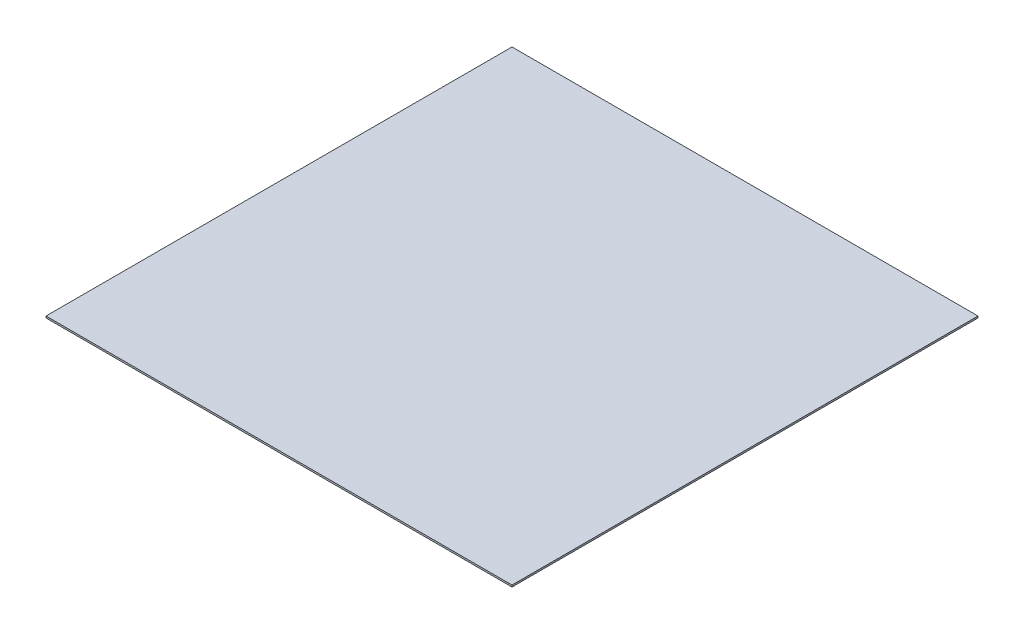
ISO-10303-21;
HEADER;
FILE_DESCRIPTION(('STEP AP214'),'2;1');
FILE_NAME('part.step','',(''),(''),'','','');
FILE_SCHEMA(('AUTOMOTIVE_DESIGN { 1 0 10303 214 1 1 1 1 }'));
ENDSEC;
DATA;
#1=APPLICATION_CONTEXT('core data for automotive mechanical design processes');
#2=APPLICATION_PROTOCOL_DEFINITION('international standard','automotive_design',2000,#1);
#3=PRODUCT_CONTEXT('',#1,'mechanical');
#4=PRODUCT('Part','Part','',(#3));
#5=PRODUCT_RELATED_PRODUCT_CATEGORY('part','',(#4));
#6=PRODUCT_DEFINITION_FORMATION('','',#4);
#7=PRODUCT_DEFINITION_CONTEXT('part definition',#1,'design');
#8=PRODUCT_DEFINITION('design','',#6,#7);
#9=PRODUCT_DEFINITION_SHAPE('','',#8);
#10=(LENGTH_UNIT() NAMED_UNIT(*) SI_UNIT(.MILLI.,.METRE.));
#11=(NAMED_UNIT(*) PLANE_ANGLE_UNIT() SI_UNIT($,.RADIAN.));
#12=(NAMED_UNIT(*) SI_UNIT($,.STERADIAN.) SOLID_ANGLE_UNIT());
#13=UNCERTAINTY_MEASURE_WITH_UNIT(LENGTH_MEASURE(1.E-05),#10,'distance_accuracy_value','');
#14=(GEOMETRIC_REPRESENTATION_CONTEXT(3) GLOBAL_UNCERTAINTY_ASSIGNED_CONTEXT((#13)) GLOBAL_UNIT_ASSIGNED_CONTEXT((#10,
#11,#12)) REPRESENTATION_CONTEXT('',''));
#15=CARTESIAN_POINT('',(0.,0.,0.));
#16=DIRECTION('',(0.,0.,1.));
#17=DIRECTION('',(1.,0.,0.));
#18=AXIS2_PLACEMENT_3D('',#15,#16,#17);
#19=CARTESIAN_POINT('',(400.,3.,400.));
#20=DIRECTION('',(-1.,0.,0.));
#21=DIRECTION('',(0.,0.,1.));
#22=AXIS2_PLACEMENT_3D('',#19,#20,#21);
#23=PLANE('',#22);
#24=DIRECTION('',(0.,0.,-1.));
#25=VECTOR('',#24,1.);
#26=CARTESIAN_POINT('',(400.,0.,400.));
#27=LINE('',#26,#25);
#28=CARTESIAN_POINT('',(400.,0.,400.));
#29=VERTEX_POINT('',#28);
#30=CARTESIAN_POINT('',(400.,0.,-400.));
#31=VERTEX_POINT('',#30);
#32=EDGE_CURVE('E98',#29,#31,#27,.T.);
#33=ORIENTED_EDGE('',*,*,#32,.T.);
#34=DIRECTION('',(0.,-1.,0.));
#35=VECTOR('',#34,1.);
#36=CARTESIAN_POINT('',(400.,3.,-400.));
#37=LINE('',#36,#35);
#38=CARTESIAN_POINT('',(400.,3.,-400.));
#39=VERTEX_POINT('',#38);
#40=EDGE_CURVE('E11',#39,#31,#37,.T.);
#41=ORIENTED_EDGE('',*,*,#40,.F.);
#42=DIRECTION('',(0.,0.,-1.));
#43=VECTOR('',#42,1.);
#44=CARTESIAN_POINT('',(400.,3.,400.));
#45=LINE('',#44,#43);
#46=CARTESIAN_POINT('',(400.,3.,400.));
#47=VERTEX_POINT('',#46);
#48=EDGE_CURVE('E86',#47,#39,#45,.T.);
#49=ORIENTED_EDGE('',*,*,#48,.F.);
#50=DIRECTION('',(0.,-1.,0.));
#51=VECTOR('',#50,1.);
#52=CARTESIAN_POINT('',(400.,3.,400.));
#53=LINE('',#52,#51);
#54=EDGE_CURVE('E94',#47,#29,#53,.T.);
#55=ORIENTED_EDGE('',*,*,#54,.T.);
#56=EDGE_LOOP('',(#33,#41,#49,#55));
#57=FACE_BOUND('',#56,.T.);
#58=ADVANCED_FACE('F35',(#57),#23,.F.);
#59=CARTESIAN_POINT('',(-400.,3.,-400.));
#60=DIRECTION('',(0.,0.,1.));
#61=DIRECTION('',(1.,0.,0.));
#62=AXIS2_PLACEMENT_3D('',#59,#60,#61);
#63=PLANE('',#62);
#64=DIRECTION('',(-1.,0.,0.));
#65=VECTOR('',#64,1.);
#66=CARTESIAN_POINT('',(-400.,0.,-400.));
#67=LINE('',#66,#65);
#68=CARTESIAN_POINT('',(-400.,0.,-400.));
#69=VERTEX_POINT('',#68);
#70=EDGE_CURVE('E90',#31,#69,#67,.T.);
#71=ORIENTED_EDGE('',*,*,#70,.T.);
#72=DIRECTION('',(0.,-1.,0.));
#73=VECTOR('',#72,1.);
#74=CARTESIAN_POINT('',(-400.,3.,-400.));
#75=LINE('',#74,#73);
#76=CARTESIAN_POINT('',(-400.,3.,-400.));
#77=VERTEX_POINT('',#76);
#78=EDGE_CURVE('E43',#77,#69,#75,.T.);
#79=ORIENTED_EDGE('',*,*,#78,.F.);
#80=DIRECTION('',(-1.,0.,0.));
#81=VECTOR('',#80,1.);
#82=CARTESIAN_POINT('',(-400.,3.,-400.));
#83=LINE('',#82,#81);
#84=EDGE_CURVE('E81',#39,#77,#83,.T.);
#85=ORIENTED_EDGE('',*,*,#84,.F.);
#86=ORIENTED_EDGE('',*,*,#40,.T.);
#87=EDGE_LOOP('',(#71,#79,#85,#86));
#88=FACE_BOUND('',#87,.T.);
#89=ADVANCED_FACE('F89',(#88),#63,.F.);
#90=CARTESIAN_POINT('',(-400.,3.,400.));
#91=DIRECTION('',(1.,0.,0.));
#92=DIRECTION('',(0.,0.,-1.));
#93=AXIS2_PLACEMENT_3D('',#90,#91,#92);
#94=PLANE('',#93);
#95=DIRECTION('',(0.,0.,1.));
#96=VECTOR('',#95,1.);
#97=CARTESIAN_POINT('',(-400.,0.,400.));
#98=LINE('',#97,#96);
#99=CARTESIAN_POINT('',(-400.,0.,400.));
#100=VERTEX_POINT('',#99);
#101=EDGE_CURVE('E68',#69,#100,#98,.T.);
#102=ORIENTED_EDGE('',*,*,#101,.T.);
#103=DIRECTION('',(0.,-1.,0.));
#104=VECTOR('',#103,1.);
#105=CARTESIAN_POINT('',(-400.,3.,400.));
#106=LINE('',#105,#104);
#107=CARTESIAN_POINT('',(-400.,3.,400.));
#108=VERTEX_POINT('',#107);
#109=EDGE_CURVE('E91',#108,#100,#106,.T.);
#110=ORIENTED_EDGE('',*,*,#109,.F.);
#111=DIRECTION('',(0.,0.,1.));
#112=VECTOR('',#111,1.);
#113=CARTESIAN_POINT('',(-400.,3.,400.));
#114=LINE('',#113,#112);
#115=EDGE_CURVE('E84',#77,#108,#114,.T.);
#116=ORIENTED_EDGE('',*,*,#115,.F.);
#117=ORIENTED_EDGE('',*,*,#78,.T.);
#118=EDGE_LOOP('',(#102,#110,#116,#117));
#119=FACE_BOUND('',#118,.T.);
#120=ADVANCED_FACE('F92',(#119),#94,.F.);
#121=CARTESIAN_POINT('',(-400.,3.,400.));
#122=DIRECTION('',(0.,0.,-1.));
#123=DIRECTION('',(-1.,0.,0.));
#124=AXIS2_PLACEMENT_3D('',#121,#122,#123);
#125=PLANE('',#124);
#126=DIRECTION('',(1.,0.,0.));
#127=VECTOR('',#126,1.);
#128=CARTESIAN_POINT('',(-400.,0.,400.));
#129=LINE('',#128,#127);
#130=EDGE_CURVE('E74',#100,#29,#129,.T.);
#131=ORIENTED_EDGE('',*,*,#130,.T.);
#132=ORIENTED_EDGE('',*,*,#54,.F.);
#133=DIRECTION('',(1.,0.,0.));
#134=VECTOR('',#133,1.);
#135=CARTESIAN_POINT('',(-400.,3.,400.));
#136=LINE('',#135,#134);
#137=EDGE_CURVE('E51',#108,#47,#136,.T.);
#138=ORIENTED_EDGE('',*,*,#137,.F.);
#139=ORIENTED_EDGE('',*,*,#109,.T.);
#140=EDGE_LOOP('',(#131,#132,#138,#139));
#141=FACE_BOUND('',#140,.T.);
#142=ADVANCED_FACE('F105',(#141),#125,.F.);
#143=CARTESIAN_POINT('',(0.,3.,0.));
#144=DIRECTION('',(0.,-1.,0.));
#145=DIRECTION('',(0.,0.,-1.));
#146=AXIS2_PLACEMENT_3D('',#143,#144,#145);
#147=PLANE('',#146);
#148=ORIENTED_EDGE('',*,*,#48,.T.);
#149=ORIENTED_EDGE('',*,*,#84,.T.);
#150=ORIENTED_EDGE('',*,*,#115,.T.);
#151=ORIENTED_EDGE('',*,*,#137,.T.);
#152=EDGE_LOOP('',(#148,#149,#150,#151));
#153=FACE_BOUND('',#152,.T.);
#154=ADVANCED_FACE('F82',(#153),#147,.F.);
#155=CARTESIAN_POINT('',(0.,0.,0.));
#156=DIRECTION('',(0.,-1.,0.));
#157=DIRECTION('',(0.,0.,-1.));
#158=AXIS2_PLACEMENT_3D('',#155,#156,#157);
#159=PLANE('',#158);
#160=ORIENTED_EDGE('',*,*,#32,.F.);
#161=ORIENTED_EDGE('',*,*,#130,.F.);
#162=ORIENTED_EDGE('',*,*,#101,.F.);
#163=ORIENTED_EDGE('',*,*,#70,.F.);
#164=EDGE_LOOP('',(#160,#161,#162,#163));
#165=FACE_BOUND('',#164,.T.);
#166=ADVANCED_FACE('F108',(#165),#159,.T.);
#167=CLOSED_SHELL('',(#58,#89,#120,#142,#154,#166));
#168=MANIFOLD_SOLID_BREP('B2',#167);
#169=ADVANCED_BREP_SHAPE_REPRESENTATION('',(#18,#168),#14);
#170=SHAPE_DEFINITION_REPRESENTATION(#9,#169);
ENDSEC;
END-ISO-10303-21;
